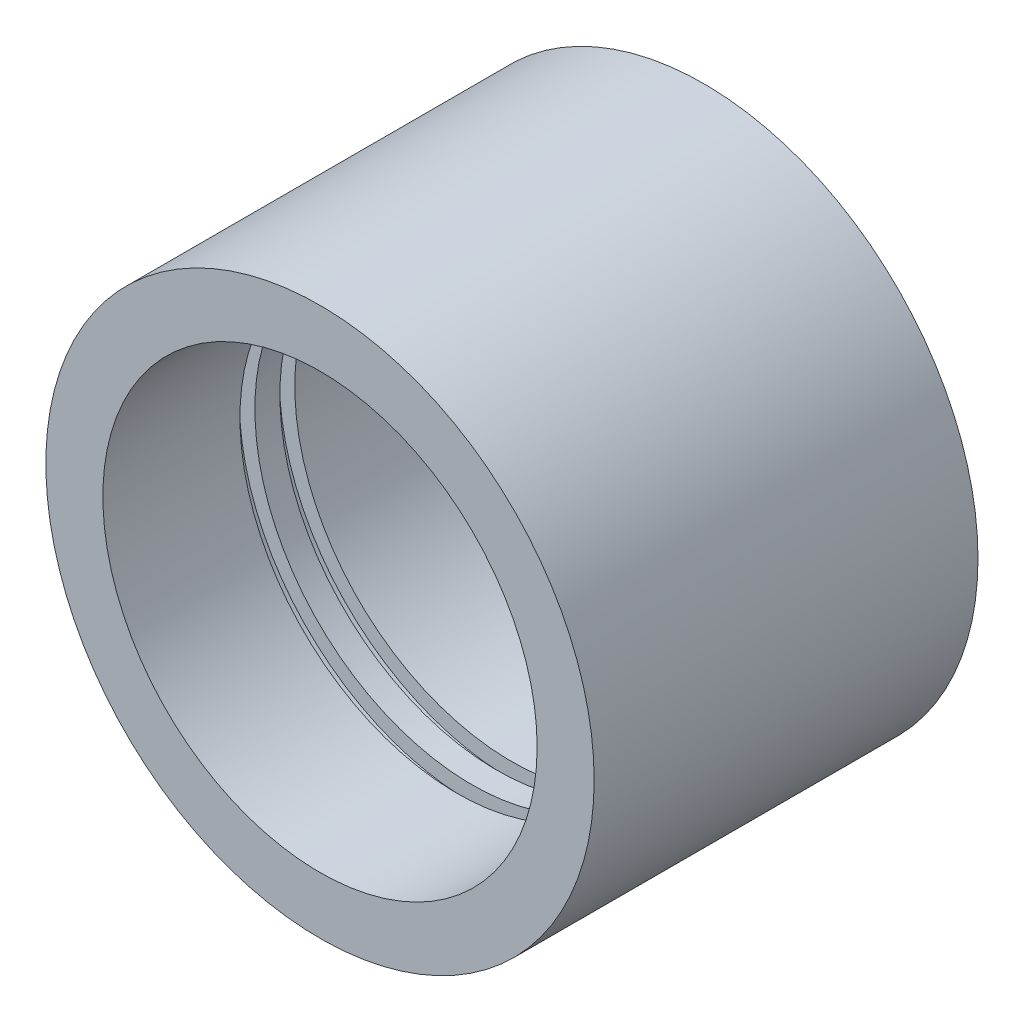
ISO-10303-21;
HEADER;
FILE_DESCRIPTION(('STEP AP214'),'2;1');
FILE_NAME('part.step','',(''),(''),'','','');
FILE_SCHEMA(('AUTOMOTIVE_DESIGN { 1 0 10303 214 1 1 1 1 }'));
ENDSEC;
DATA;
#1=APPLICATION_CONTEXT('core data for automotive mechanical design processes');
#2=APPLICATION_PROTOCOL_DEFINITION('international standard','automotive_design',2000,#1);
#3=PRODUCT_CONTEXT('',#1,'mechanical');
#4=PRODUCT('Part','Part','',(#3));
#5=PRODUCT_RELATED_PRODUCT_CATEGORY('part','',(#4));
#6=PRODUCT_DEFINITION_FORMATION('','',#4);
#7=PRODUCT_DEFINITION_CONTEXT('part definition',#1,'design');
#8=PRODUCT_DEFINITION('design','',#6,#7);
#9=PRODUCT_DEFINITION_SHAPE('','',#8);
#10=(LENGTH_UNIT() NAMED_UNIT(*) SI_UNIT(.MILLI.,.METRE.));
#11=(NAMED_UNIT(*) PLANE_ANGLE_UNIT() SI_UNIT($,.RADIAN.));
#12=(NAMED_UNIT(*) SI_UNIT($,.STERADIAN.) SOLID_ANGLE_UNIT());
#13=UNCERTAINTY_MEASURE_WITH_UNIT(LENGTH_MEASURE(1.E-05),#10,'distance_accuracy_value','');
#14=(GEOMETRIC_REPRESENTATION_CONTEXT(3) GLOBAL_UNCERTAINTY_ASSIGNED_CONTEXT((#13)) GLOBAL_UNIT_ASSIGNED_CONTEXT((#10,
#11,#12)) REPRESENTATION_CONTEXT('',''));
#15=CARTESIAN_POINT('',(0.,0.,0.));
#16=DIRECTION('',(0.,0.,1.));
#17=DIRECTION('',(1.,0.,0.));
#18=AXIS2_PLACEMENT_3D('',#15,#16,#17);
#19=CARTESIAN_POINT('',(0.,0.,0.));
#20=DIRECTION('',(0.,0.,1.));
#21=DIRECTION('',(1.,0.,0.));
#22=AXIS2_PLACEMENT_3D('',#19,#20,#21);
#23=CYLINDRICAL_SURFACE('',#22,31.75);
#24=CARTESIAN_POINT('',(0.,0.,0.));
#25=DIRECTION('',(0.,0.,1.));
#26=DIRECTION('',(1.,0.,0.));
#27=AXIS2_PLACEMENT_3D('',#24,#25,#26);
#28=CIRCLE('',#27,31.75);
#29=CARTESIAN_POINT('',(31.75,0.,0.));
#30=VERTEX_POINT('',#29);
#31=EDGE_CURVE('E96',#30,#30,#28,.T.);
#32=ORIENTED_EDGE('',*,*,#31,.F.);
#33=EDGE_LOOP('',(#32));
#34=FACE_BOUND('',#33,.T.);
#35=CARTESIAN_POINT('',(0.,0.,-44.45));
#36=DIRECTION('',(0.,0.,1.));
#37=DIRECTION('',(1.,0.,0.));
#38=AXIS2_PLACEMENT_3D('',#35,#36,#37);
#39=CIRCLE('',#38,31.75);
#40=CARTESIAN_POINT('',(31.75,0.,-44.45));
#41=VERTEX_POINT('',#40);
#42=EDGE_CURVE('E10',#41,#41,#39,.T.);
#43=ORIENTED_EDGE('',*,*,#42,.T.);
#44=EDGE_LOOP('',(#43));
#45=FACE_BOUND('',#44,.T.);
#46=ADVANCED_FACE('F37',(#34,#45),#23,.T.);
#47=CARTESIAN_POINT('',(0.,31.75,-44.45));
#48=DIRECTION('',(0.,0.,1.));
#49=DIRECTION('',(1.,0.,0.));
#50=AXIS2_PLACEMENT_3D('',#47,#48,#49);
#51=PLANE('',#50);
#52=ORIENTED_EDGE('',*,*,#42,.F.);
#53=EDGE_LOOP('',(#52));
#54=FACE_BOUND('',#53,.T.);
#55=CARTESIAN_POINT('',(0.,0.,-44.45));
#56=DIRECTION('',(0.,0.,1.));
#57=DIRECTION('',(1.,0.,0.));
#58=AXIS2_PLACEMENT_3D('',#55,#56,#57);
#59=CIRCLE('',#58,19.05);
#60=CARTESIAN_POINT('',(19.05,0.,-44.45));
#61=VERTEX_POINT('',#60);
#62=EDGE_CURVE('E44',#61,#61,#59,.T.);
#63=ORIENTED_EDGE('',*,*,#62,.T.);
#64=EDGE_LOOP('',(#63));
#65=FACE_BOUND('',#64,.T.);
#66=ADVANCED_FACE('F104',(#54,#65),#51,.F.);
#67=CARTESIAN_POINT('',(0.,0.,0.));
#68=DIRECTION('',(0.,0.,1.));
#69=DIRECTION('',(1.,0.,0.));
#70=AXIS2_PLACEMENT_3D('',#67,#68,#69);
#71=CYLINDRICAL_SURFACE('',#70,19.05);
#72=ORIENTED_EDGE('',*,*,#62,.F.);
#73=EDGE_LOOP('',(#72));
#74=FACE_BOUND('',#73,.T.);
#75=CARTESIAN_POINT('',(0.,0.,-38.1));
#76=DIRECTION('',(0.,0.,1.));
#77=DIRECTION('',(1.,0.,0.));
#78=AXIS2_PLACEMENT_3D('',#75,#76,#77);
#79=CIRCLE('',#78,19.05);
#80=CARTESIAN_POINT('',(19.05,0.,-38.1));
#81=VERTEX_POINT('',#80);
#82=EDGE_CURVE('E49',#81,#81,#79,.T.);
#83=ORIENTED_EDGE('',*,*,#82,.T.);
#84=EDGE_LOOP('',(#83));
#85=FACE_BOUND('',#84,.T.);
#86=ADVANCED_FACE('F108',(#74,#85),#71,.F.);
#87=CARTESIAN_POINT('',(0.,19.05,-38.1));
#88=DIRECTION('',(0.,0.,-1.));
#89=DIRECTION('',(-1.,0.,0.));
#90=AXIS2_PLACEMENT_3D('',#87,#88,#89);
#91=PLANE('',#90);
#92=ORIENTED_EDGE('',*,*,#82,.F.);
#93=EDGE_LOOP('',(#92));
#94=FACE_BOUND('',#93,.T.);
#95=CARTESIAN_POINT('',(0.,0.,-38.1));
#96=DIRECTION('',(0.,0.,1.));
#97=DIRECTION('',(1.,0.,0.));
#98=AXIS2_PLACEMENT_3D('',#95,#96,#97);
#99=CIRCLE('',#98,25.146);
#100=CARTESIAN_POINT('',(25.146,0.,-38.1));
#101=VERTEX_POINT('',#100);
#102=EDGE_CURVE('E54',#101,#101,#99,.T.);
#103=ORIENTED_EDGE('',*,*,#102,.T.);
#104=EDGE_LOOP('',(#103));
#105=FACE_BOUND('',#104,.T.);
#106=ADVANCED_FACE('F113',(#94,#105),#91,.F.);
#107=CARTESIAN_POINT('',(0.,0.,0.));
#108=DIRECTION('',(0.,0.,1.));
#109=DIRECTION('',(1.,0.,0.));
#110=AXIS2_PLACEMENT_3D('',#107,#108,#109);
#111=CYLINDRICAL_SURFACE('',#110,25.146);
#112=ORIENTED_EDGE('',*,*,#102,.F.);
#113=EDGE_LOOP('',(#112));
#114=FACE_BOUND('',#113,.T.);
#115=CARTESIAN_POINT('',(0.,0.,-22.225));
#116=DIRECTION('',(0.,0.,1.));
#117=DIRECTION('',(1.,0.,0.));
#118=AXIS2_PLACEMENT_3D('',#115,#116,#117);
#119=CIRCLE('',#118,25.146);
#120=CARTESIAN_POINT('',(25.146,0.,-22.225));
#121=VERTEX_POINT('',#120);
#122=EDGE_CURVE('E60',#121,#121,#119,.T.);
#123=ORIENTED_EDGE('',*,*,#122,.T.);
#124=EDGE_LOOP('',(#123));
#125=FACE_BOUND('',#124,.T.);
#126=ADVANCED_FACE('F119',(#114,#125),#111,.F.);
#127=CARTESIAN_POINT('',(0.,26.9494,-22.225));
#128=DIRECTION('',(0.,0.,-1.));
#129=DIRECTION('',(-1.,0.,0.));
#130=AXIS2_PLACEMENT_3D('',#127,#128,#129);
#131=PLANE('',#130);
#132=ORIENTED_EDGE('',*,*,#122,.F.);
#133=EDGE_LOOP('',(#132));
#134=FACE_BOUND('',#133,.T.);
#135=CARTESIAN_POINT('',(0.,0.,-22.225));
#136=DIRECTION('',(0.,0.,1.));
#137=DIRECTION('',(1.,0.,0.));
#138=AXIS2_PLACEMENT_3D('',#135,#136,#137);
#139=CIRCLE('',#138,26.9494);
#140=CARTESIAN_POINT('',(26.9494,0.,-22.225));
#141=VERTEX_POINT('',#140);
#142=EDGE_CURVE('E64',#141,#141,#139,.T.);
#143=ORIENTED_EDGE('',*,*,#142,.T.);
#144=EDGE_LOOP('',(#143));
#145=FACE_BOUND('',#144,.T.);
#146=ADVANCED_FACE('F123',(#134,#145),#131,.F.);
#147=CARTESIAN_POINT('',(0.,0.,0.));
#148=DIRECTION('',(0.,0.,1.));
#149=DIRECTION('',(1.,0.,0.));
#150=AXIS2_PLACEMENT_3D('',#147,#148,#149);
#151=CYLINDRICAL_SURFACE('',#150,26.9494);
#152=ORIENTED_EDGE('',*,*,#142,.F.);
#153=EDGE_LOOP('',(#152));
#154=FACE_BOUND('',#153,.T.);
#155=CARTESIAN_POINT('',(0.,0.,-20.4978));
#156=DIRECTION('',(0.,0.,1.));
#157=DIRECTION('',(1.,0.,0.));
#158=AXIS2_PLACEMENT_3D('',#155,#156,#157);
#159=CIRCLE('',#158,26.9494);
#160=CARTESIAN_POINT('',(26.9494,0.,-20.4978));
#161=VERTEX_POINT('',#160);
#162=EDGE_CURVE('E68',#161,#161,#159,.T.);
#163=ORIENTED_EDGE('',*,*,#162,.T.);
#164=EDGE_LOOP('',(#163));
#165=FACE_BOUND('',#164,.T.);
#166=ADVANCED_FACE('F127',(#154,#165),#151,.F.);
#167=CARTESIAN_POINT('',(0.,25.146,-20.4978));
#168=DIRECTION('',(0.,0.,1.));
#169=DIRECTION('',(1.,0.,0.));
#170=AXIS2_PLACEMENT_3D('',#167,#168,#169);
#171=PLANE('',#170);
#172=ORIENTED_EDGE('',*,*,#162,.F.);
#173=EDGE_LOOP('',(#172));
#174=FACE_BOUND('',#173,.T.);
#175=CARTESIAN_POINT('',(0.,0.,-20.4978));
#176=DIRECTION('',(0.,0.,1.));
#177=DIRECTION('',(1.,0.,0.));
#178=AXIS2_PLACEMENT_3D('',#175,#176,#177);
#179=CIRCLE('',#178,25.146);
#180=CARTESIAN_POINT('',(25.146,0.,-20.4978));
#181=VERTEX_POINT('',#180);
#182=EDGE_CURVE('E72',#181,#181,#179,.T.);
#183=ORIENTED_EDGE('',*,*,#182,.T.);
#184=EDGE_LOOP('',(#183));
#185=FACE_BOUND('',#184,.T.);
#186=ADVANCED_FACE('F131',(#174,#185),#171,.F.);
#187=CARTESIAN_POINT('',(0.,0.,0.));
#188=DIRECTION('',(0.,0.,1.));
#189=DIRECTION('',(1.,0.,0.));
#190=AXIS2_PLACEMENT_3D('',#187,#188,#189);
#191=CYLINDRICAL_SURFACE('',#190,25.146);
#192=ORIENTED_EDGE('',*,*,#182,.F.);
#193=EDGE_LOOP('',(#192));
#194=FACE_BOUND('',#193,.T.);
#195=CARTESIAN_POINT('',(0.,0.,-17.6022));
#196=DIRECTION('',(0.,0.,1.));
#197=DIRECTION('',(1.,0.,0.));
#198=AXIS2_PLACEMENT_3D('',#195,#196,#197);
#199=CIRCLE('',#198,25.146);
#200=CARTESIAN_POINT('',(25.146,0.,-17.6022));
#201=VERTEX_POINT('',#200);
#202=EDGE_CURVE('E76',#201,#201,#199,.T.);
#203=ORIENTED_EDGE('',*,*,#202,.T.);
#204=EDGE_LOOP('',(#203));
#205=FACE_BOUND('',#204,.T.);
#206=ADVANCED_FACE('F135',(#194,#205),#191,.F.);
#207=CARTESIAN_POINT('',(0.,26.9494,-17.6022));
#208=DIRECTION('',(0.,0.,-1.));
#209=DIRECTION('',(-1.,0.,0.));
#210=AXIS2_PLACEMENT_3D('',#207,#208,#209);
#211=PLANE('',#210);
#212=ORIENTED_EDGE('',*,*,#202,.F.);
#213=EDGE_LOOP('',(#212));
#214=FACE_BOUND('',#213,.T.);
#215=CARTESIAN_POINT('',(0.,0.,-17.6022));
#216=DIRECTION('',(0.,0.,1.));
#217=DIRECTION('',(1.,0.,0.));
#218=AXIS2_PLACEMENT_3D('',#215,#216,#217);
#219=CIRCLE('',#218,26.9494);
#220=CARTESIAN_POINT('',(26.9494,0.,-17.6022));
#221=VERTEX_POINT('',#220);
#222=EDGE_CURVE('E80',#221,#221,#219,.T.);
#223=ORIENTED_EDGE('',*,*,#222,.T.);
#224=EDGE_LOOP('',(#223));
#225=FACE_BOUND('',#224,.T.);
#226=ADVANCED_FACE('F139',(#214,#225),#211,.F.);
#227=CARTESIAN_POINT('',(0.,0.,0.));
#228=DIRECTION('',(0.,0.,1.));
#229=DIRECTION('',(1.,0.,0.));
#230=AXIS2_PLACEMENT_3D('',#227,#228,#229);
#231=CYLINDRICAL_SURFACE('',#230,26.9494);
#232=ORIENTED_EDGE('',*,*,#222,.F.);
#233=EDGE_LOOP('',(#232));
#234=FACE_BOUND('',#233,.T.);
#235=CARTESIAN_POINT('',(0.,0.,-15.875));
#236=DIRECTION('',(0.,0.,1.));
#237=DIRECTION('',(1.,0.,0.));
#238=AXIS2_PLACEMENT_3D('',#235,#236,#237);
#239=CIRCLE('',#238,26.9494);
#240=CARTESIAN_POINT('',(26.9494,0.,-15.875));
#241=VERTEX_POINT('',#240);
#242=EDGE_CURVE('E84',#241,#241,#239,.T.);
#243=ORIENTED_EDGE('',*,*,#242,.T.);
#244=EDGE_LOOP('',(#243));
#245=FACE_BOUND('',#244,.T.);
#246=ADVANCED_FACE('F143',(#234,#245),#231,.F.);
#247=CARTESIAN_POINT('',(0.,25.146,-15.875));
#248=DIRECTION('',(0.,0.,1.));
#249=DIRECTION('',(1.,0.,0.));
#250=AXIS2_PLACEMENT_3D('',#247,#248,#249);
#251=PLANE('',#250);
#252=ORIENTED_EDGE('',*,*,#242,.F.);
#253=EDGE_LOOP('',(#252));
#254=FACE_BOUND('',#253,.T.);
#255=CARTESIAN_POINT('',(0.,0.,-15.875));
#256=DIRECTION('',(0.,0.,1.));
#257=DIRECTION('',(1.,0.,0.));
#258=AXIS2_PLACEMENT_3D('',#255,#256,#257);
#259=CIRCLE('',#258,25.146);
#260=CARTESIAN_POINT('',(25.146,0.,-15.875));
#261=VERTEX_POINT('',#260);
#262=EDGE_CURVE('E88',#261,#261,#259,.T.);
#263=ORIENTED_EDGE('',*,*,#262,.T.);
#264=EDGE_LOOP('',(#263));
#265=FACE_BOUND('',#264,.T.);
#266=ADVANCED_FACE('F147',(#254,#265),#251,.F.);
#267=CARTESIAN_POINT('',(0.,0.,0.));
#268=DIRECTION('',(0.,0.,1.));
#269=DIRECTION('',(1.,0.,0.));
#270=AXIS2_PLACEMENT_3D('',#267,#268,#269);
#271=CYLINDRICAL_SURFACE('',#270,25.146);
#272=ORIENTED_EDGE('',*,*,#262,.F.);
#273=EDGE_LOOP('',(#272));
#274=FACE_BOUND('',#273,.T.);
#275=CARTESIAN_POINT('',(0.,0.,0.));
#276=DIRECTION('',(0.,0.,1.));
#277=DIRECTION('',(1.,0.,0.));
#278=AXIS2_PLACEMENT_3D('',#275,#276,#277);
#279=CIRCLE('',#278,25.146);
#280=CARTESIAN_POINT('',(25.146,0.,0.));
#281=VERTEX_POINT('',#280);
#282=EDGE_CURVE('E92',#281,#281,#279,.T.);
#283=ORIENTED_EDGE('',*,*,#282,.T.);
#284=EDGE_LOOP('',(#283));
#285=FACE_BOUND('',#284,.T.);
#286=ADVANCED_FACE('F151',(#274,#285),#271,.F.);
#287=CARTESIAN_POINT('',(0.,25.146,0.));
#288=DIRECTION('',(0.,0.,-1.));
#289=DIRECTION('',(-1.,0.,0.));
#290=AXIS2_PLACEMENT_3D('',#287,#288,#289);
#291=PLANE('',#290);
#292=ORIENTED_EDGE('',*,*,#282,.F.);
#293=EDGE_LOOP('',(#292));
#294=FACE_BOUND('',#293,.T.);
#295=ORIENTED_EDGE('',*,*,#31,.T.);
#296=EDGE_LOOP('',(#295));
#297=FACE_BOUND('',#296,.T.);
#298=ADVANCED_FACE('F101',(#294,#297),#291,.F.);
#299=CLOSED_SHELL('',(#46,#66,#86,#106,#126,#146,#166,#186,#206,#226,#246,#266,#286,#298));
#300=MANIFOLD_SOLID_BREP('B2',#299);
#301=ADVANCED_BREP_SHAPE_REPRESENTATION('',(#18,#300),#14);
#302=SHAPE_DEFINITION_REPRESENTATION(#9,#301);
ENDSEC;
END-ISO-10303-21;
